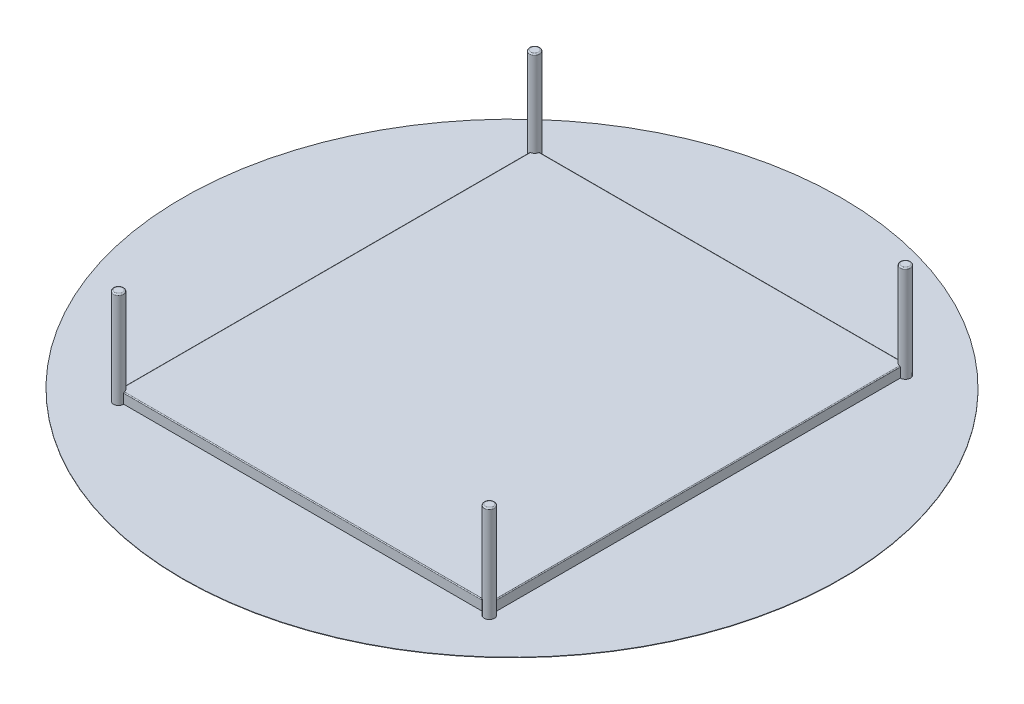
ISO-10303-21;
HEADER;
FILE_DESCRIPTION(('STEP AP214'),'2;1');
FILE_NAME('part.step','',(''),(''),'','','');
FILE_SCHEMA(('AUTOMOTIVE_DESIGN { 1 0 10303 214 1 1 1 1 }'));
ENDSEC;
DATA;
#1=APPLICATION_CONTEXT('core data for automotive mechanical design processes');
#2=APPLICATION_PROTOCOL_DEFINITION('international standard','automotive_design',2000,#1);
#3=PRODUCT_CONTEXT('',#1,'mechanical');
#4=PRODUCT('Part','Part','',(#3));
#5=PRODUCT_RELATED_PRODUCT_CATEGORY('part','',(#4));
#6=PRODUCT_DEFINITION_FORMATION('','',#4);
#7=PRODUCT_DEFINITION_CONTEXT('part definition',#1,'design');
#8=PRODUCT_DEFINITION('design','',#6,#7);
#9=PRODUCT_DEFINITION_SHAPE('','',#8);
#10=(LENGTH_UNIT() NAMED_UNIT(*) SI_UNIT(.MILLI.,.METRE.));
#11=(NAMED_UNIT(*) PLANE_ANGLE_UNIT() SI_UNIT($,.RADIAN.));
#12=(NAMED_UNIT(*) SI_UNIT($,.STERADIAN.) SOLID_ANGLE_UNIT());
#13=UNCERTAINTY_MEASURE_WITH_UNIT(LENGTH_MEASURE(1.E-05),#10,'distance_accuracy_value','');
#14=(GEOMETRIC_REPRESENTATION_CONTEXT(3) GLOBAL_UNCERTAINTY_ASSIGNED_CONTEXT((#13)) GLOBAL_UNIT_ASSIGNED_CONTEXT((#10,
#11,#12)) REPRESENTATION_CONTEXT('',''));
#15=CARTESIAN_POINT('',(0.,0.,0.));
#16=DIRECTION('',(0.,0.,1.));
#17=DIRECTION('',(1.,0.,0.));
#18=AXIS2_PLACEMENT_3D('',#15,#16,#17);
#19=CARTESIAN_POINT('',(450.,26.,505.));
#20=DIRECTION('',(-1.,0.,0.));
#21=DIRECTION('',(0.,0.,1.));
#22=AXIS2_PLACEMENT_3D('',#19,#20,#21);
#23=PLANE('',#22);
#24=DIRECTION('',(0.,-1.,0.));
#25=VECTOR('',#24,1.);
#26=CARTESIAN_POINT('',(450.,26.,-505.));
#27=LINE('',#26,#25);
#28=CARTESIAN_POINT('',(450.,24.,-505.));
#29=VERTEX_POINT('',#28);
#30=CARTESIAN_POINT('',(450.,1.,-505.));
#31=VERTEX_POINT('',#30);
#32=EDGE_CURVE('E93',#29,#31,#27,.T.);
#33=ORIENTED_EDGE('',*,*,#32,.F.);
#34=DIRECTION('',(0.,0.,-1.));
#35=VECTOR('',#34,1.);
#36=CARTESIAN_POINT('',(450.,24.,505.));
#37=LINE('',#36,#35);
#38=CARTESIAN_POINT('',(450.,24.,505.));
#39=VERTEX_POINT('',#38);
#40=EDGE_CURVE('E12',#29,#39,#37,.F.);
#41=ORIENTED_EDGE('',*,*,#40,.T.);
#42=DIRECTION('',(0.,-1.,0.));
#43=VECTOR('',#42,1.);
#44=CARTESIAN_POINT('',(450.,26.,505.));
#45=LINE('',#44,#43);
#46=CARTESIAN_POINT('',(450.,1.,505.));
#47=VERTEX_POINT('',#46);
#48=EDGE_CURVE('E113',#39,#47,#45,.T.);
#49=ORIENTED_EDGE('',*,*,#48,.T.);
#50=DIRECTION('',(0.,0.,-1.));
#51=VECTOR('',#50,1.);
#52=CARTESIAN_POINT('',(450.,1.,505.));
#53=LINE('',#52,#51);
#54=EDGE_CURVE('E108',#47,#31,#53,.T.);
#55=ORIENTED_EDGE('',*,*,#54,.T.);
#56=EDGE_LOOP('',(#33,#41,#49,#55));
#57=FACE_BOUND('',#56,.T.);
#58=ADVANCED_FACE('F41',(#57),#23,.F.);
#59=CARTESIAN_POINT('',(-450.,26.,-505.));
#60=DIRECTION('',(0.,0.,1.));
#61=DIRECTION('',(1.,0.,0.));
#62=AXIS2_PLACEMENT_3D('',#59,#60,#61);
#63=PLANE('',#62);
#64=DIRECTION('',(0.,-1.,0.));
#65=VECTOR('',#64,1.);
#66=CARTESIAN_POINT('',(-450.,26.,-505.));
#67=LINE('',#66,#65);
#68=CARTESIAN_POINT('',(-450.,24.,-505.));
#69=VERTEX_POINT('',#68);
#70=CARTESIAN_POINT('',(-450.,1.,-505.));
#71=VERTEX_POINT('',#70);
#72=EDGE_CURVE('E102',#69,#71,#67,.T.);
#73=ORIENTED_EDGE('',*,*,#72,.F.);
#74=DIRECTION('',(-1.,0.,0.));
#75=VECTOR('',#74,1.);
#76=CARTESIAN_POINT('',(-450.,24.,-505.));
#77=LINE('',#76,#75);
#78=EDGE_CURVE('E50',#69,#29,#77,.F.);
#79=ORIENTED_EDGE('',*,*,#78,.T.);
#80=ORIENTED_EDGE('',*,*,#32,.T.);
#81=DIRECTION('',(-1.,0.,0.));
#82=VECTOR('',#81,1.);
#83=CARTESIAN_POINT('',(-450.,1.,-505.));
#84=LINE('',#83,#82);
#85=EDGE_CURVE('E96',#31,#71,#84,.T.);
#86=ORIENTED_EDGE('',*,*,#85,.T.);
#87=EDGE_LOOP('',(#73,#79,#80,#86));
#88=FACE_BOUND('',#87,.T.);
#89=ADVANCED_FACE('F95',(#88),#63,.F.);
#90=CARTESIAN_POINT('',(-450.,26.,505.));
#91=DIRECTION('',(1.,0.,0.));
#92=DIRECTION('',(0.,0.,-1.));
#93=AXIS2_PLACEMENT_3D('',#90,#91,#92);
#94=PLANE('',#93);
#95=DIRECTION('',(0.,-1.,0.));
#96=VECTOR('',#95,1.);
#97=CARTESIAN_POINT('',(-450.,26.,505.));
#98=LINE('',#97,#96);
#99=CARTESIAN_POINT('',(-450.,24.,505.));
#100=VERTEX_POINT('',#99);
#101=CARTESIAN_POINT('',(-450.,1.,505.));
#102=VERTEX_POINT('',#101);
#103=EDGE_CURVE('E123',#100,#102,#98,.T.);
#104=ORIENTED_EDGE('',*,*,#103,.F.);
#105=DIRECTION('',(0.,0.,1.));
#106=VECTOR('',#105,1.);
#107=CARTESIAN_POINT('',(-450.,24.,505.));
#108=LINE('',#107,#106);
#109=EDGE_CURVE('E65',#100,#69,#108,.F.);
#110=ORIENTED_EDGE('',*,*,#109,.T.);
#111=ORIENTED_EDGE('',*,*,#72,.T.);
#112=DIRECTION('',(0.,0.,1.));
#113=VECTOR('',#112,1.);
#114=CARTESIAN_POINT('',(-450.,1.,505.));
#115=LINE('',#114,#113);
#116=EDGE_CURVE('E110',#71,#102,#115,.T.);
#117=ORIENTED_EDGE('',*,*,#116,.T.);
#118=EDGE_LOOP('',(#104,#110,#111,#117));
#119=FACE_BOUND('',#118,.T.);
#120=ADVANCED_FACE('F161',(#119),#94,.F.);
#121=CARTESIAN_POINT('',(-450.,26.,505.));
#122=DIRECTION('',(0.,0.,-1.));
#123=DIRECTION('',(-1.,0.,0.));
#124=AXIS2_PLACEMENT_3D('',#121,#122,#123);
#125=PLANE('',#124);
#126=ORIENTED_EDGE('',*,*,#48,.F.);
#127=DIRECTION('',(1.,0.,0.));
#128=VECTOR('',#127,1.);
#129=CARTESIAN_POINT('',(-450.,24.,505.));
#130=LINE('',#129,#128);
#131=EDGE_CURVE('E134',#39,#100,#130,.F.);
#132=ORIENTED_EDGE('',*,*,#131,.T.);
#133=ORIENTED_EDGE('',*,*,#103,.T.);
#134=DIRECTION('',(1.,0.,0.));
#135=VECTOR('',#134,1.);
#136=CARTESIAN_POINT('',(-450.,1.,505.));
#137=LINE('',#136,#135);
#138=EDGE_CURVE('E120',#102,#47,#137,.T.);
#139=ORIENTED_EDGE('',*,*,#138,.T.);
#140=EDGE_LOOP('',(#126,#132,#133,#139));
#141=FACE_BOUND('',#140,.T.);
#142=ADVANCED_FACE('F160',(#141),#125,.F.);
#143=CARTESIAN_POINT('',(450.,26.,-505.));
#144=DIRECTION('',(0.,-1.,0.));
#145=DIRECTION('',(0.,0.,-1.));
#146=AXIS2_PLACEMENT_3D('',#143,#144,#145);
#147=PLANE('',#146);
#148=DIRECTION('',(0.,0.,1.));
#149=VECTOR('',#148,1.);
#150=CARTESIAN_POINT('',(-448.,26.,-505.));
#151=LINE('',#150,#149);
#152=CARTESIAN_POINT('',(-448.,26.,-503.));
#153=VERTEX_POINT('',#152);
#154=CARTESIAN_POINT('',(-448.,26.,503.));
#155=VERTEX_POINT('',#154);
#156=EDGE_CURVE('E129',#153,#155,#151,.T.);
#157=ORIENTED_EDGE('',*,*,#156,.T.);
#158=DIRECTION('',(1.,0.,0.));
#159=VECTOR('',#158,1.);
#160=CARTESIAN_POINT('',(450.,26.,503.));
#161=LINE('',#160,#159);
#162=CARTESIAN_POINT('',(448.,26.,503.));
#163=VERTEX_POINT('',#162);
#164=EDGE_CURVE('E131',#155,#163,#161,.T.);
#165=ORIENTED_EDGE('',*,*,#164,.T.);
#166=DIRECTION('',(0.,0.,-1.));
#167=VECTOR('',#166,1.);
#168=CARTESIAN_POINT('',(448.,26.,-505.));
#169=LINE('',#168,#167);
#170=CARTESIAN_POINT('',(448.,26.,-503.));
#171=VERTEX_POINT('',#170);
#172=EDGE_CURVE('E101',#163,#171,#169,.T.);
#173=ORIENTED_EDGE('',*,*,#172,.T.);
#174=DIRECTION('',(-1.,0.,0.));
#175=VECTOR('',#174,1.);
#176=CARTESIAN_POINT('',(450.,26.,-503.));
#177=LINE('',#176,#175);
#178=EDGE_CURVE('E127',#171,#153,#177,.T.);
#179=ORIENTED_EDGE('',*,*,#178,.T.);
#180=EDGE_LOOP('',(#157,#165,#173,#179));
#181=FACE_BOUND('',#180,.T.);
#182=ADVANCED_FACE('F153',(#181),#147,.F.);
#183=CARTESIAN_POINT('',(450.,1.,-505.));
#184=DIRECTION('',(0.,-1.,0.));
#185=DIRECTION('',(0.,0.,-1.));
#186=AXIS2_PLACEMENT_3D('',#183,#184,#185);
#187=PLANE('',#186);
#188=ORIENTED_EDGE('',*,*,#54,.F.);
#189=ORIENTED_EDGE('',*,*,#138,.F.);
#190=ORIENTED_EDGE('',*,*,#116,.F.);
#191=ORIENTED_EDGE('',*,*,#85,.F.);
#192=EDGE_LOOP('',(#188,#189,#190,#191));
#193=FACE_BOUND('',#192,.T.);
#194=ADVANCED_FACE('F106',(#193),#187,.T.);
#195=CARTESIAN_POINT('',(450.,24.,-503.));
#196=DIRECTION('',(-1.,0.,0.));
#197=DIRECTION('',(0.,0.,1.));
#198=AXIS2_PLACEMENT_3D('',#195,#196,#197);
#199=CYLINDRICAL_SURFACE('',#198,2.);
#200=CARTESIAN_POINT('',(448.,24.,-503.));
#201=DIRECTION('',(-0.707106781186547,0.,-0.707106781186547));
#202=DIRECTION('',(0.707106781186547,0.,-0.707106781186547));
#203=AXIS2_PLACEMENT_3D('',#200,#201,#202);
#204=ELLIPSE('',#203,2.82842712474619,2.);
#205=EDGE_CURVE('E117',#29,#171,#204,.F.);
#206=ORIENTED_EDGE('',*,*,#205,.F.);
#207=ORIENTED_EDGE('',*,*,#78,.F.);
#208=CARTESIAN_POINT('',(-448.,24.,-503.));
#209=DIRECTION('',(-0.707106781186547,0.,0.707106781186547));
#210=DIRECTION('',(-0.707106781186547,0.,-0.707106781186547));
#211=AXIS2_PLACEMENT_3D('',#208,#209,#210);
#212=ELLIPSE('',#211,2.82842712474619,2.);
#213=EDGE_CURVE('E45',#153,#69,#212,.T.);
#214=ORIENTED_EDGE('',*,*,#213,.F.);
#215=ORIENTED_EDGE('',*,*,#178,.F.);
#216=EDGE_LOOP('',(#206,#207,#214,#215));
#217=FACE_BOUND('',#216,.T.);
#218=ADVANCED_FACE('F43',(#217),#199,.T.);
#219=CARTESIAN_POINT('',(-448.,24.,-505.));
#220=DIRECTION('',(0.,0.,1.));
#221=DIRECTION('',(1.,0.,0.));
#222=AXIS2_PLACEMENT_3D('',#219,#220,#221);
#223=CYLINDRICAL_SURFACE('',#222,2.);
#224=ORIENTED_EDGE('',*,*,#213,.T.);
#225=ORIENTED_EDGE('',*,*,#109,.F.);
#226=CARTESIAN_POINT('',(-448.,24.,503.));
#227=DIRECTION('',(0.707106781186547,0.,0.707106781186547));
#228=DIRECTION('',(-0.707106781186547,0.,0.707106781186547));
#229=AXIS2_PLACEMENT_3D('',#226,#227,#228);
#230=ELLIPSE('',#229,2.82842712474619,2.);
#231=EDGE_CURVE('E141',#155,#100,#230,.T.);
#232=ORIENTED_EDGE('',*,*,#231,.F.);
#233=ORIENTED_EDGE('',*,*,#156,.F.);
#234=EDGE_LOOP('',(#224,#225,#232,#233));
#235=FACE_BOUND('',#234,.T.);
#236=ADVANCED_FACE('F178',(#235),#223,.T.);
#237=CARTESIAN_POINT('',(448.,24.,-505.));
#238=DIRECTION('',(0.,0.,-1.));
#239=DIRECTION('',(-1.,0.,0.));
#240=AXIS2_PLACEMENT_3D('',#237,#238,#239);
#241=CYLINDRICAL_SURFACE('',#240,2.);
#242=ORIENTED_EDGE('',*,*,#205,.T.);
#243=ORIENTED_EDGE('',*,*,#172,.F.);
#244=CARTESIAN_POINT('',(448.,24.,503.));
#245=DIRECTION('',(0.707106781186547,0.,-0.707106781186547));
#246=DIRECTION('',(-0.707106781186547,0.,-0.707106781186547));
#247=AXIS2_PLACEMENT_3D('',#244,#245,#246);
#248=ELLIPSE('',#247,2.82842712474619,2.);
#249=EDGE_CURVE('E139',#39,#163,#248,.F.);
#250=ORIENTED_EDGE('',*,*,#249,.F.);
#251=ORIENTED_EDGE('',*,*,#40,.F.);
#252=EDGE_LOOP('',(#242,#243,#250,#251));
#253=FACE_BOUND('',#252,.T.);
#254=ADVANCED_FACE('F146',(#253),#241,.T.);
#255=CARTESIAN_POINT('',(450.,24.,503.));
#256=DIRECTION('',(1.,0.,0.));
#257=DIRECTION('',(0.,0.,-1.));
#258=AXIS2_PLACEMENT_3D('',#255,#256,#257);
#259=CYLINDRICAL_SURFACE('',#258,2.);
#260=ORIENTED_EDGE('',*,*,#231,.T.);
#261=ORIENTED_EDGE('',*,*,#131,.F.);
#262=ORIENTED_EDGE('',*,*,#249,.T.);
#263=ORIENTED_EDGE('',*,*,#164,.F.);
#264=EDGE_LOOP('',(#260,#261,#262,#263));
#265=FACE_BOUND('',#264,.T.);
#266=ADVANCED_FACE('F157',(#265),#259,.T.);
#267=CLOSED_SHELL('',(#58,#89,#120,#142,#182,#194,#218,#236,#254,#266));
#268=MANIFOLD_SOLID_BREP('B2',#267);
#269=CARTESIAN_POINT('',(0.,1.,0.));
#270=DIRECTION('',(0.,1.,0.));
#271=DIRECTION('',(0.,0.,1.));
#272=AXIS2_PLACEMENT_3D('',#269,#270,#271);
#273=PLANE('',#272);
#274=CARTESIAN_POINT('',(450.,1.,-505.));
#275=DIRECTION('',(0.,1.,0.));
#276=DIRECTION('',(0.,0.,1.));
#277=AXIS2_PLACEMENT_3D('',#274,#275,#276);
#278=CIRCLE('',#277,12.5);
#279=CARTESIAN_POINT('',(450.,1.,-492.5));
#280=VERTEX_POINT('',#279);
#281=EDGE_CURVE('E289',#280,#280,#278,.T.);
#282=ORIENTED_EDGE('',*,*,#281,.F.);
#283=EDGE_LOOP('',(#282));
#284=FACE_BOUND('',#283,.T.);
#285=CARTESIAN_POINT('',(-450.,1.,505.));
#286=DIRECTION('',(0.,1.,0.));
#287=DIRECTION('',(0.,0.,1.));
#288=AXIS2_PLACEMENT_3D('',#285,#286,#287);
#289=CIRCLE('',#288,12.5);
#290=CARTESIAN_POINT('',(-450.,1.,517.5));
#291=VERTEX_POINT('',#290);
#292=EDGE_CURVE('E281',#291,#291,#289,.T.);
#293=ORIENTED_EDGE('',*,*,#292,.F.);
#294=EDGE_LOOP('',(#293));
#295=FACE_BOUND('',#294,.T.);
#296=CARTESIAN_POINT('',(0.,1.,0.));
#297=DIRECTION('',(0.,1.,0.));
#298=DIRECTION('',(0.,0.,1.));
#299=AXIS2_PLACEMENT_3D('',#296,#297,#298);
#300=CIRCLE('',#299,800.);
#301=CARTESIAN_POINT('',(0.,1.,800.));
#302=VERTEX_POINT('',#301);
#303=EDGE_CURVE('E277',#302,#302,#300,.T.);
#304=ORIENTED_EDGE('',*,*,#303,.T.);
#305=EDGE_LOOP('',(#304));
#306=FACE_BOUND('',#305,.T.);
#307=CARTESIAN_POINT('',(450.,1.,505.));
#308=DIRECTION('',(0.,1.,0.));
#309=DIRECTION('',(0.,0.,1.));
#310=AXIS2_PLACEMENT_3D('',#307,#308,#309);
#311=CIRCLE('',#310,12.5);
#312=CARTESIAN_POINT('',(450.,1.,517.5));
#313=VERTEX_POINT('',#312);
#314=EDGE_CURVE('E286',#313,#313,#311,.T.);
#315=ORIENTED_EDGE('',*,*,#314,.F.);
#316=EDGE_LOOP('',(#315));
#317=FACE_BOUND('',#316,.T.);
#318=CARTESIAN_POINT('',(-450.,1.,-505.));
#319=DIRECTION('',(0.,1.,0.));
#320=DIRECTION('',(0.,0.,1.));
#321=AXIS2_PLACEMENT_3D('',#318,#319,#320);
#322=CIRCLE('',#321,12.5);
#323=CARTESIAN_POINT('',(-450.,1.,-492.5));
#324=VERTEX_POINT('',#323);
#325=EDGE_CURVE('E292',#324,#324,#322,.T.);
#326=ORIENTED_EDGE('',*,*,#325,.F.);
#327=EDGE_LOOP('',(#326));
#328=FACE_BOUND('',#327,.T.);
#329=ADVANCED_FACE('F245',(#284,#295,#306,#317,#328),#273,.T.);
#330=CARTESIAN_POINT('',(0.,1.,0.));
#331=DIRECTION('',(0.,-1.,0.));
#332=DIRECTION('',(0.,0.,-1.));
#333=AXIS2_PLACEMENT_3D('',#330,#331,#332);
#334=CYLINDRICAL_SURFACE('',#333,800.);
#335=ORIENTED_EDGE('',*,*,#303,.F.);
#336=EDGE_LOOP('',(#335));
#337=FACE_BOUND('',#336,.T.);
#338=CARTESIAN_POINT('',(0.,0.,0.));
#339=DIRECTION('',(0.,1.,0.));
#340=DIRECTION('',(0.,0.,1.));
#341=AXIS2_PLACEMENT_3D('',#338,#339,#340);
#342=CIRCLE('',#341,800.);
#343=CARTESIAN_POINT('',(0.,0.,800.));
#344=VERTEX_POINT('',#343);
#345=EDGE_CURVE('E278',#344,#344,#342,.T.);
#346=ORIENTED_EDGE('',*,*,#345,.T.);
#347=EDGE_LOOP('',(#346));
#348=FACE_BOUND('',#347,.T.);
#349=ADVANCED_FACE('F299',(#337,#348),#334,.T.);
#350=CARTESIAN_POINT('',(0.,0.,0.));
#351=DIRECTION('',(0.,1.,0.));
#352=DIRECTION('',(0.,0.,1.));
#353=AXIS2_PLACEMENT_3D('',#350,#351,#352);
#354=PLANE('',#353);
#355=ORIENTED_EDGE('',*,*,#345,.F.);
#356=EDGE_LOOP('',(#355));
#357=FACE_BOUND('',#356,.T.);
#358=ADVANCED_FACE('F305',(#357),#354,.F.);
#359=CARTESIAN_POINT('',(-450.,235.,505.));
#360=DIRECTION('',(0.,-1.,0.));
#361=DIRECTION('',(0.,0.,-1.));
#362=AXIS2_PLACEMENT_3D('',#359,#360,#361);
#363=CYLINDRICAL_SURFACE('',#362,12.5);
#364=CARTESIAN_POINT('',(-450.,232.,505.));
#365=DIRECTION('',(0.,1.,0.));
#366=DIRECTION('',(0.,0.,1.));
#367=AXIS2_PLACEMENT_3D('',#364,#365,#366);
#368=CIRCLE('',#367,12.5);
#369=CARTESIAN_POINT('',(-450.,232.,517.5));
#370=VERTEX_POINT('',#369);
#371=EDGE_CURVE('E265',#370,#370,#368,.F.);
#372=ORIENTED_EDGE('',*,*,#371,.T.);
#373=EDGE_LOOP('',(#372));
#374=FACE_BOUND('',#373,.T.);
#375=ORIENTED_EDGE('',*,*,#292,.T.);
#376=EDGE_LOOP('',(#375));
#377=FACE_BOUND('',#376,.T.);
#378=ADVANCED_FACE('F312',(#374,#377),#363,.T.);
#379=CARTESIAN_POINT('',(-450.,235.,505.));
#380=DIRECTION('',(0.,1.,0.));
#381=DIRECTION('',(0.,0.,1.));
#382=AXIS2_PLACEMENT_3D('',#379,#380,#381);
#383=PLANE('',#382);
#384=CARTESIAN_POINT('',(-450.,235.,505.));
#385=DIRECTION('',(0.,1.,0.));
#386=DIRECTION('',(0.,0.,1.));
#387=AXIS2_PLACEMENT_3D('',#384,#385,#386);
#388=CIRCLE('',#387,9.50000000000001);
#389=CARTESIAN_POINT('',(-450.,235.,514.5));
#390=VERTEX_POINT('',#389);
#391=EDGE_CURVE('E268',#390,#390,#388,.T.);
#392=ORIENTED_EDGE('',*,*,#391,.T.);
#393=EDGE_LOOP('',(#392));
#394=FACE_BOUND('',#393,.T.);
#395=ADVANCED_FACE('F355',(#394),#383,.T.);
#396=CARTESIAN_POINT('',(450.,235.,505.));
#397=DIRECTION('',(0.,-1.,0.));
#398=DIRECTION('',(0.,0.,-1.));
#399=AXIS2_PLACEMENT_3D('',#396,#397,#398);
#400=CYLINDRICAL_SURFACE('',#399,12.5);
#401=CARTESIAN_POINT('',(450.,232.,505.));
#402=DIRECTION('',(0.,1.,0.));
#403=DIRECTION('',(0.,0.,1.));
#404=AXIS2_PLACEMENT_3D('',#401,#402,#403);
#405=CIRCLE('',#404,12.5);
#406=CARTESIAN_POINT('',(450.,232.,517.5));
#407=VERTEX_POINT('',#406);
#408=EDGE_CURVE('E271',#407,#407,#405,.F.);
#409=ORIENTED_EDGE('',*,*,#408,.T.);
#410=EDGE_LOOP('',(#409));
#411=FACE_BOUND('',#410,.T.);
#412=ORIENTED_EDGE('',*,*,#314,.T.);
#413=EDGE_LOOP('',(#412));
#414=FACE_BOUND('',#413,.T.);
#415=ADVANCED_FACE('F352',(#411,#414),#400,.T.);
#416=CARTESIAN_POINT('',(450.,235.,505.));
#417=DIRECTION('',(0.,1.,0.));
#418=DIRECTION('',(0.,0.,1.));
#419=AXIS2_PLACEMENT_3D('',#416,#417,#418);
#420=PLANE('',#419);
#421=CARTESIAN_POINT('',(450.,235.,505.));
#422=DIRECTION('',(0.,1.,0.));
#423=DIRECTION('',(0.,0.,1.));
#424=AXIS2_PLACEMENT_3D('',#421,#422,#423);
#425=CIRCLE('',#424,9.50000000000001);
#426=CARTESIAN_POINT('',(450.,235.,514.5));
#427=VERTEX_POINT('',#426);
#428=EDGE_CURVE('E274',#427,#427,#425,.T.);
#429=ORIENTED_EDGE('',*,*,#428,.T.);
#430=EDGE_LOOP('',(#429));
#431=FACE_BOUND('',#430,.T.);
#432=ADVANCED_FACE('F345',(#431),#420,.T.);
#433=CARTESIAN_POINT('',(450.,235.,-505.));
#434=DIRECTION('',(0.,-1.,0.));
#435=DIRECTION('',(0.,0.,-1.));
#436=AXIS2_PLACEMENT_3D('',#433,#434,#435);
#437=CYLINDRICAL_SURFACE('',#436,12.5);
#438=CARTESIAN_POINT('',(450.,232.,-505.));
#439=DIRECTION('',(0.,1.,0.));
#440=DIRECTION('',(0.,0.,1.));
#441=AXIS2_PLACEMENT_3D('',#438,#439,#440);
#442=CIRCLE('',#441,12.5);
#443=CARTESIAN_POINT('',(450.,232.,-492.5));
#444=VERTEX_POINT('',#443);
#445=EDGE_CURVE('E256',#444,#444,#442,.F.);
#446=ORIENTED_EDGE('',*,*,#445,.T.);
#447=EDGE_LOOP('',(#446));
#448=FACE_BOUND('',#447,.T.);
#449=ORIENTED_EDGE('',*,*,#281,.T.);
#450=EDGE_LOOP('',(#449));
#451=FACE_BOUND('',#450,.T.);
#452=ADVANCED_FACE('F338',(#448,#451),#437,.T.);
#453=CARTESIAN_POINT('',(450.,235.,-505.));
#454=DIRECTION('',(0.,1.,0.));
#455=DIRECTION('',(0.,0.,1.));
#456=AXIS2_PLACEMENT_3D('',#453,#454,#455);
#457=PLANE('',#456);
#458=CARTESIAN_POINT('',(450.,235.,-505.));
#459=DIRECTION('',(0.,1.,0.));
#460=DIRECTION('',(0.,0.,1.));
#461=AXIS2_PLACEMENT_3D('',#458,#459,#460);
#462=CIRCLE('',#461,9.50000000000001);
#463=CARTESIAN_POINT('',(450.,235.,-495.5));
#464=VERTEX_POINT('',#463);
#465=EDGE_CURVE('E260',#464,#464,#462,.T.);
#466=ORIENTED_EDGE('',*,*,#465,.T.);
#467=EDGE_LOOP('',(#466));
#468=FACE_BOUND('',#467,.T.);
#469=ADVANCED_FACE('F336',(#468),#457,.T.);
#470=CARTESIAN_POINT('',(-450.,235.,-505.));
#471=DIRECTION('',(0.,-1.,0.));
#472=DIRECTION('',(0.,0.,-1.));
#473=AXIS2_PLACEMENT_3D('',#470,#471,#472);
#474=CYLINDRICAL_SURFACE('',#473,12.5);
#475=CARTESIAN_POINT('',(-450.,232.,-505.));
#476=DIRECTION('',(0.,1.,0.));
#477=DIRECTION('',(0.,0.,1.));
#478=AXIS2_PLACEMENT_3D('',#475,#476,#477);
#479=CIRCLE('',#478,12.5);
#480=CARTESIAN_POINT('',(-450.,232.,-492.5));
#481=VERTEX_POINT('',#480);
#482=EDGE_CURVE('E40',#481,#481,#479,.F.);
#483=ORIENTED_EDGE('',*,*,#482,.T.);
#484=EDGE_LOOP('',(#483));
#485=FACE_BOUND('',#484,.T.);
#486=ORIENTED_EDGE('',*,*,#325,.T.);
#487=EDGE_LOOP('',(#486));
#488=FACE_BOUND('',#487,.T.);
#489=ADVANCED_FACE('F296',(#485,#488),#474,.T.);
#490=CARTESIAN_POINT('',(-450.,235.,-505.));
#491=DIRECTION('',(0.,1.,0.));
#492=DIRECTION('',(0.,0.,1.));
#493=AXIS2_PLACEMENT_3D('',#490,#491,#492);
#494=PLANE('',#493);
#495=CARTESIAN_POINT('',(-450.,235.,-505.));
#496=DIRECTION('',(0.,1.,0.));
#497=DIRECTION('',(0.,0.,1.));
#498=AXIS2_PLACEMENT_3D('',#495,#496,#497);
#499=CIRCLE('',#498,9.50000000000001);
#500=CARTESIAN_POINT('',(-450.,235.,-495.5));
#501=VERTEX_POINT('',#500);
#502=EDGE_CURVE('E252',#501,#501,#499,.T.);
#503=ORIENTED_EDGE('',*,*,#502,.T.);
#504=EDGE_LOOP('',(#503));
#505=FACE_BOUND('',#504,.T.);
#506=ADVANCED_FACE('F321',(#505),#494,.T.);
#507=CARTESIAN_POINT('',(450.,232.,505.));
#508=DIRECTION('',(0.,1.,0.));
#509=DIRECTION('',(0.,0.,1.));
#510=AXIS2_PLACEMENT_3D('',#507,#508,#509);
#511=TOROIDAL_SURFACE('',#510,9.50000000000001,3.);
#512=ORIENTED_EDGE('',*,*,#408,.F.);
#513=EDGE_LOOP('',(#512));
#514=FACE_BOUND('',#513,.T.);
#515=ORIENTED_EDGE('',*,*,#428,.F.);
#516=EDGE_LOOP('',(#515));
#517=FACE_BOUND('',#516,.T.);
#518=ADVANCED_FACE('F317',(#514,#517),#511,.T.);
#519=CARTESIAN_POINT('',(-450.,232.,505.));
#520=DIRECTION('',(0.,1.,0.));
#521=DIRECTION('',(0.,0.,1.));
#522=AXIS2_PLACEMENT_3D('',#519,#520,#521);
#523=TOROIDAL_SURFACE('',#522,9.50000000000001,3.);
#524=ORIENTED_EDGE('',*,*,#371,.F.);
#525=EDGE_LOOP('',(#524));
#526=FACE_BOUND('',#525,.T.);
#527=ORIENTED_EDGE('',*,*,#391,.F.);
#528=EDGE_LOOP('',(#527));
#529=FACE_BOUND('',#528,.T.);
#530=ADVANCED_FACE('F320',(#526,#529),#523,.T.);
#531=CARTESIAN_POINT('',(450.,232.,-505.));
#532=DIRECTION('',(0.,1.,0.));
#533=DIRECTION('',(0.,0.,1.));
#534=AXIS2_PLACEMENT_3D('',#531,#532,#533);
#535=TOROIDAL_SURFACE('',#534,9.50000000000001,3.);
#536=ORIENTED_EDGE('',*,*,#445,.F.);
#537=EDGE_LOOP('',(#536));
#538=FACE_BOUND('',#537,.T.);
#539=ORIENTED_EDGE('',*,*,#465,.F.);
#540=EDGE_LOOP('',(#539));
#541=FACE_BOUND('',#540,.T.);
#542=ADVANCED_FACE('F324',(#538,#541),#535,.T.);
#543=CARTESIAN_POINT('',(-450.,232.,-505.));
#544=DIRECTION('',(0.,1.,0.));
#545=DIRECTION('',(0.,0.,1.));
#546=AXIS2_PLACEMENT_3D('',#543,#544,#545);
#547=TOROIDAL_SURFACE('',#546,9.50000000000001,3.);
#548=ORIENTED_EDGE('',*,*,#482,.F.);
#549=EDGE_LOOP('',(#548));
#550=FACE_BOUND('',#549,.T.);
#551=ORIENTED_EDGE('',*,*,#502,.F.);
#552=EDGE_LOOP('',(#551));
#553=FACE_BOUND('',#552,.T.);
#554=ADVANCED_FACE('F247',(#550,#553),#547,.T.);
#555=CLOSED_SHELL('',(#329,#349,#358,#378,#395,#415,#432,#452,#469,#489,#506,#518,#530,#542,#554));
#556=MANIFOLD_SOLID_BREP('B6',#555);
#557=ADVANCED_BREP_SHAPE_REPRESENTATION('',(#18,#268,#556),#14);
#558=SHAPE_DEFINITION_REPRESENTATION(#9,#557);
ENDSEC;
END-ISO-10303-21;
